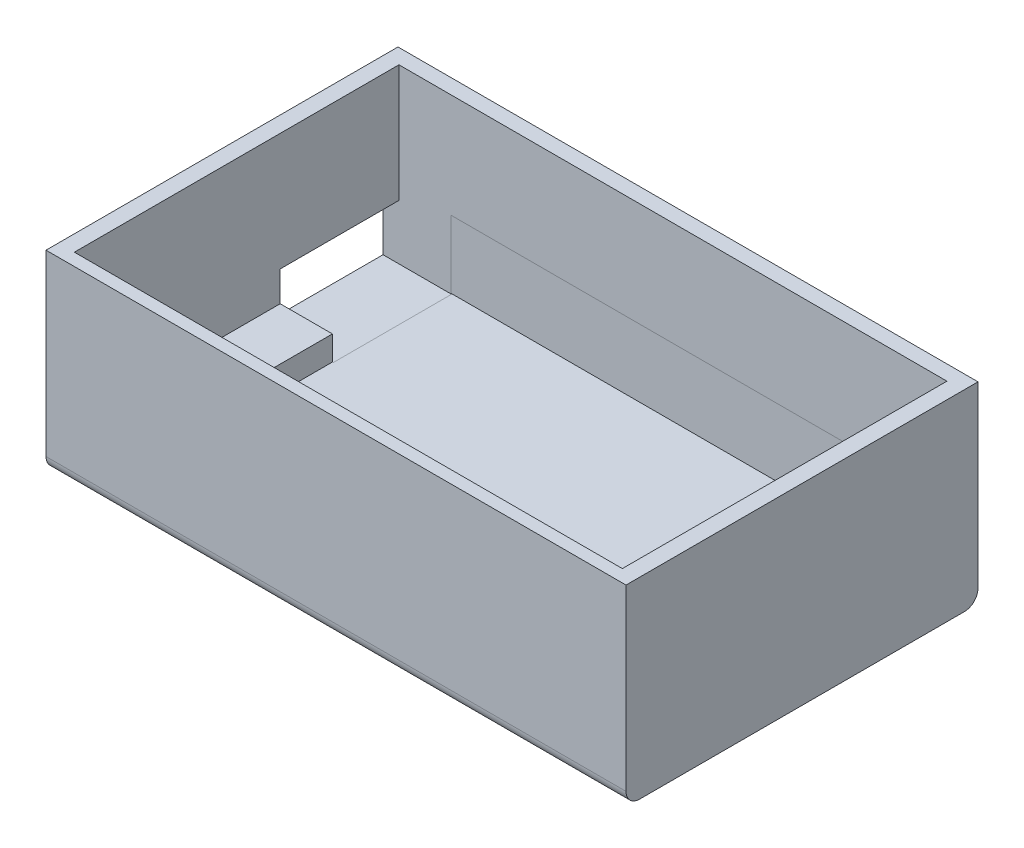
ISO-10303-21;
HEADER;
FILE_DESCRIPTION(('STEP AP214'),'2;1');
FILE_NAME('part.step','',(''),(''),'','','');
FILE_SCHEMA(('AUTOMOTIVE_DESIGN { 1 0 10303 214 1 1 1 1 }'));
ENDSEC;
DATA;
#1=APPLICATION_CONTEXT('core data for automotive mechanical design processes');
#2=APPLICATION_PROTOCOL_DEFINITION('international standard','automotive_design',2000,#1);
#3=PRODUCT_CONTEXT('',#1,'mechanical');
#4=PRODUCT('Part','Part','',(#3));
#5=PRODUCT_RELATED_PRODUCT_CATEGORY('part','',(#4));
#6=PRODUCT_DEFINITION_FORMATION('','',#4);
#7=PRODUCT_DEFINITION_CONTEXT('part definition',#1,'design');
#8=PRODUCT_DEFINITION('design','',#6,#7);
#9=PRODUCT_DEFINITION_SHAPE('','',#8);
#10=(LENGTH_UNIT() NAMED_UNIT(*) SI_UNIT(.MILLI.,.METRE.));
#11=(NAMED_UNIT(*) PLANE_ANGLE_UNIT() SI_UNIT($,.RADIAN.));
#12=(NAMED_UNIT(*) SI_UNIT($,.STERADIAN.) SOLID_ANGLE_UNIT());
#13=UNCERTAINTY_MEASURE_WITH_UNIT(LENGTH_MEASURE(1.E-05),#10,'distance_accuracy_value','');
#14=(GEOMETRIC_REPRESENTATION_CONTEXT(3) GLOBAL_UNCERTAINTY_ASSIGNED_CONTEXT((#13)) GLOBAL_UNIT_ASSIGNED_CONTEXT((#10,
#11,#12)) REPRESENTATION_CONTEXT('',''));
#15=CARTESIAN_POINT('',(0.,0.,0.));
#16=DIRECTION('',(0.,0.,1.));
#17=DIRECTION('',(1.,0.,0.));
#18=AXIS2_PLACEMENT_3D('',#15,#16,#17);
#19=CARTESIAN_POINT('',(-29.7360338558105,16.51,-43.4502757419288));
#20=DIRECTION('',(1.,0.,0.));
#21=DIRECTION('',(0.,0.,-1.));
#22=AXIS2_PLACEMENT_3D('',#19,#20,#21);
#23=PLANE('',#22);
#24=DIRECTION('',(0.,0.,1.));
#25=VECTOR('',#24,1.);
#26=CARTESIAN_POINT('',(-29.7360338558105,16.51,-43.4502757419288));
#27=LINE('',#26,#25);
#28=CARTESIAN_POINT('',(-29.7360338558105,16.51,-43.4502757419288));
#29=VERTEX_POINT('',#28);
#30=CARTESIAN_POINT('',(-29.7360338558105,16.51,-43.4401653698579));
#31=VERTEX_POINT('',#30);
#32=EDGE_CURVE('E327',#29,#31,#27,.T.);
#33=ORIENTED_EDGE('',*,*,#32,.T.);
#34=DIRECTION('',(0.,1.,0.));
#35=VECTOR('',#34,1.);
#36=CARTESIAN_POINT('',(-29.7360338558105,16.51,-43.4401653698579));
#37=LINE('',#36,#35);
#38=CARTESIAN_POINT('',(-29.7360338558105,3.81,-43.4401653698579));
#39=VERTEX_POINT('',#38);
#40=EDGE_CURVE('E315',#39,#31,#37,.T.);
#41=ORIENTED_EDGE('',*,*,#40,.F.);
#42=DIRECTION('',(0.,0.,1.));
#43=VECTOR('',#42,1.);
#44=CARTESIAN_POINT('',(-29.7360338558105,3.81,-43.4502757419288));
#45=LINE('',#44,#43);
#46=CARTESIAN_POINT('',(-29.7360338558105,3.81,-43.4502757419288));
#47=VERTEX_POINT('',#46);
#48=EDGE_CURVE('E324',#47,#39,#45,.T.);
#49=ORIENTED_EDGE('',*,*,#48,.F.);
#50=DIRECTION('',(0.,-1.,0.));
#51=VECTOR('',#50,1.);
#52=CARTESIAN_POINT('',(-29.7360338558105,16.51,-43.4502757419288));
#53=LINE('',#52,#51);
#54=EDGE_CURVE('E347',#29,#47,#53,.T.);
#55=ORIENTED_EDGE('',*,*,#54,.F.);
#56=EDGE_LOOP('',(#33,#41,#49,#55));
#57=FACE_BOUND('',#56,.T.);
#58=ADVANCED_FACE('F65',(#57),#23,.T.);
#59=CARTESIAN_POINT('',(-42.5250491079234,3.81,-46.2471717968124));
#60=DIRECTION('',(1.,0.,0.));
#61=DIRECTION('',(0.,0.,-1.));
#62=AXIS2_PLACEMENT_3D('',#59,#60,#61);
#63=PLANE('',#62);
#64=DIRECTION('',(0.,0.,1.));
#65=VECTOR('',#64,1.);
#66=CARTESIAN_POINT('',(-42.5250491079234,3.71364077573819,-43.4401653698579));
#67=LINE('',#66,#65);
#68=CARTESIAN_POINT('',(-42.5250491079234,3.71364077573819,-43.4401653698579));
#69=VERTEX_POINT('',#68);
#70=CARTESIAN_POINT('',(-42.5250491079234,3.71364077573819,-21.1557204367185));
#71=VERTEX_POINT('',#70);
#72=EDGE_CURVE('E288',#69,#71,#67,.T.);
#73=ORIENTED_EDGE('',*,*,#72,.F.);
#74=DIRECTION('',(0.,-1.,0.));
#75=VECTOR('',#74,1.);
#76=CARTESIAN_POINT('',(-42.5250491079234,14.0343001183845,-43.4401653698579));
#77=LINE('',#76,#75);
#78=CARTESIAN_POINT('',(-42.5250491079234,14.0343001183845,-43.4401653698579));
#79=VERTEX_POINT('',#78);
#80=EDGE_CURVE('E273',#79,#69,#77,.T.);
#81=ORIENTED_EDGE('',*,*,#80,.F.);
#82=DIRECTION('',(0.,0.,1.));
#83=VECTOR('',#82,1.);
#84=CARTESIAN_POINT('',(-42.5250491079234,14.0343001183845,-43.4401653698579));
#85=LINE('',#84,#83);
#86=CARTESIAN_POINT('',(-42.5250491079234,14.0343001183845,-21.1557204367185));
#87=VERTEX_POINT('',#86);
#88=EDGE_CURVE('E278',#79,#87,#85,.T.);
#89=ORIENTED_EDGE('',*,*,#88,.T.);
#90=DIRECTION('',(0.,-1.,0.));
#91=VECTOR('',#90,1.);
#92=CARTESIAN_POINT('',(-42.5250491079234,14.0343001183845,-21.1557204367185));
#93=LINE('',#92,#91);
#94=EDGE_CURVE('E292',#87,#71,#93,.T.);
#95=ORIENTED_EDGE('',*,*,#94,.T.);
#96=EDGE_LOOP('',(#73,#81,#89,#95));
#97=FACE_BOUND('',#96,.T.);
#98=DIRECTION('',(0.,-1.,0.));
#99=VECTOR('',#98,1.);
#100=CARTESIAN_POINT('',(-42.5250491079234,3.81,-46.2471717968124));
#101=LINE('',#100,#99);
#102=CARTESIAN_POINT('',(-42.5250491079234,36.068,-46.2471717968124));
#103=VERTEX_POINT('',#102);
#104=CARTESIAN_POINT('',(-42.5250491079234,2.54,-46.2471717968124));
#105=VERTEX_POINT('',#104);
#106=EDGE_CURVE('E364',#103,#105,#101,.T.);
#107=ORIENTED_EDGE('',*,*,#106,.T.);
#108=CARTESIAN_POINT('',(-42.5250491079234,2.54,-43.7071717968124));
#109=DIRECTION('',(1.,0.,0.));
#110=DIRECTION('',(0.,0.,-1.));
#111=AXIS2_PLACEMENT_3D('',#108,#109,#110);
#112=CIRCLE('',#111,2.54);
#113=CARTESIAN_POINT('',(-42.5250491079234,0.,-43.7071717968124));
#114=VERTEX_POINT('',#113);
#115=EDGE_CURVE('E409',#105,#114,#112,.F.);
#116=ORIENTED_EDGE('',*,*,#115,.T.);
#117=DIRECTION('',(0.,0.,1.));
#118=VECTOR('',#117,1.);
#119=CARTESIAN_POINT('',(-42.5250491079234,0.,-46.2471717968124));
#120=LINE('',#119,#118);
#121=CARTESIAN_POINT('',(-42.5250491079234,0.,17.2528282031876));
#122=VERTEX_POINT('',#121);
#123=EDGE_CURVE('E350',#114,#122,#120,.T.);
#124=ORIENTED_EDGE('',*,*,#123,.T.);
#125=CARTESIAN_POINT('',(-42.5250491079234,2.54,17.2528282031876));
#126=DIRECTION('',(1.,0.,0.));
#127=DIRECTION('',(0.,0.,-1.));
#128=AXIS2_PLACEMENT_3D('',#125,#126,#127);
#129=CIRCLE('',#128,2.54);
#130=CARTESIAN_POINT('',(-42.5250491079234,2.54,19.7928282031876));
#131=VERTEX_POINT('',#130);
#132=EDGE_CURVE('E402',#122,#131,#129,.F.);
#133=ORIENTED_EDGE('',*,*,#132,.T.);
#134=DIRECTION('',(0.,-1.,0.));
#135=VECTOR('',#134,1.);
#136=CARTESIAN_POINT('',(-42.5250491079234,3.81,19.7928282031876));
#137=LINE('',#136,#135);
#138=CARTESIAN_POINT('',(-42.5250491079234,36.068,19.7928282031876));
#139=VERTEX_POINT('',#138);
#140=EDGE_CURVE('E376',#139,#131,#137,.T.);
#141=ORIENTED_EDGE('',*,*,#140,.F.);
#142=DIRECTION('',(0.,0.,1.));
#143=VECTOR('',#142,1.);
#144=CARTESIAN_POINT('',(-42.5250491079234,36.068,19.7928282031876));
#145=LINE('',#144,#143);
#146=EDGE_CURVE('E253',#103,#139,#145,.T.);
#147=ORIENTED_EDGE('',*,*,#146,.F.);
#148=EDGE_LOOP('',(#107,#116,#124,#133,#141,#147));
#149=FACE_BOUND('',#148,.T.);
#150=ADVANCED_FACE('F458',(#97,#149),#63,.F.);
#151=CARTESIAN_POINT('',(-42.5250491079234,3.81,19.7928282031876));
#152=DIRECTION('',(0.,0.,-1.));
#153=DIRECTION('',(-1.,0.,0.));
#154=AXIS2_PLACEMENT_3D('',#151,#152,#153);
#155=PLANE('',#154);
#156=ORIENTED_EDGE('',*,*,#140,.T.);
#157=DIRECTION('',(1.,0.,0.));
#158=VECTOR('',#157,1.);
#159=CARTESIAN_POINT('',(-42.5250491079234,2.54,19.7928282031876));
#160=LINE('',#159,#158);
#161=CARTESIAN_POINT('',(66.2990539113766,2.54,19.7928282031876));
#162=VERTEX_POINT('',#161);
#163=EDGE_CURVE('E391',#131,#162,#160,.T.);
#164=ORIENTED_EDGE('',*,*,#163,.T.);
#165=DIRECTION('',(0.,-1.,0.));
#166=VECTOR('',#165,1.);
#167=CARTESIAN_POINT('',(66.2990539113766,3.81,19.7928282031876));
#168=LINE('',#167,#166);
#169=CARTESIAN_POINT('',(66.2990539113766,36.068,19.7928282031876));
#170=VERTEX_POINT('',#169);
#171=EDGE_CURVE('E372',#170,#162,#168,.T.);
#172=ORIENTED_EDGE('',*,*,#171,.F.);
#173=DIRECTION('',(1.,0.,0.));
#174=VECTOR('',#173,1.);
#175=CARTESIAN_POINT('',(66.2990539113766,36.068,19.7928282031876));
#176=LINE('',#175,#174);
#177=EDGE_CURVE('E257',#139,#170,#176,.T.);
#178=ORIENTED_EDGE('',*,*,#177,.F.);
#179=EDGE_LOOP('',(#156,#164,#172,#178));
#180=FACE_BOUND('',#179,.T.);
#181=ADVANCED_FACE('F461',(#180),#155,.F.);
#182=CARTESIAN_POINT('',(66.2990539113766,3.81,-46.2471717968124));
#183=DIRECTION('',(-1.,0.,0.));
#184=DIRECTION('',(0.,0.,1.));
#185=AXIS2_PLACEMENT_3D('',#182,#183,#184);
#186=PLANE('',#185);
#187=DIRECTION('',(0.,0.,-1.));
#188=VECTOR('',#187,1.);
#189=CARTESIAN_POINT('',(66.2990539113766,0.,-46.2471717968124));
#190=LINE('',#189,#188);
#191=CARTESIAN_POINT('',(66.2990539113766,0.,17.2528282031876));
#192=VERTEX_POINT('',#191);
#193=CARTESIAN_POINT('',(66.2990539113766,0.,-43.7071717968124));
#194=VERTEX_POINT('',#193);
#195=EDGE_CURVE('E361',#192,#194,#190,.T.);
#196=ORIENTED_EDGE('',*,*,#195,.T.);
#197=CARTESIAN_POINT('',(66.2990539113766,2.54,-43.7071717968124));
#198=DIRECTION('',(-1.,0.,0.));
#199=DIRECTION('',(0.,0.,1.));
#200=AXIS2_PLACEMENT_3D('',#197,#198,#199);
#201=CIRCLE('',#200,2.54);
#202=CARTESIAN_POINT('',(66.2990539113766,2.54,-46.2471717968124));
#203=VERTEX_POINT('',#202);
#204=EDGE_CURVE('E414',#194,#203,#201,.F.);
#205=ORIENTED_EDGE('',*,*,#204,.T.);
#206=DIRECTION('',(0.,-1.,0.));
#207=VECTOR('',#206,1.);
#208=CARTESIAN_POINT('',(66.2990539113766,3.81,-46.2471717968124));
#209=LINE('',#208,#207);
#210=CARTESIAN_POINT('',(66.2990539113766,36.068,-46.2471717968124));
#211=VERTEX_POINT('',#210);
#212=EDGE_CURVE('E368',#211,#203,#209,.T.);
#213=ORIENTED_EDGE('',*,*,#212,.F.);
#214=DIRECTION('',(0.,0.,-1.));
#215=VECTOR('',#214,1.);
#216=CARTESIAN_POINT('',(66.2990539113766,36.068,19.7928282031876));
#217=LINE('',#216,#215);
#218=EDGE_CURVE('E245',#170,#211,#217,.T.);
#219=ORIENTED_EDGE('',*,*,#218,.F.);
#220=ORIENTED_EDGE('',*,*,#171,.T.);
#221=CARTESIAN_POINT('',(66.2990539113766,2.54,17.2528282031876));
#222=DIRECTION('',(-1.,0.,0.));
#223=DIRECTION('',(0.,0.,1.));
#224=AXIS2_PLACEMENT_3D('',#221,#222,#223);
#225=CIRCLE('',#224,2.54);
#226=EDGE_CURVE('E395',#162,#192,#225,.F.);
#227=ORIENTED_EDGE('',*,*,#226,.T.);
#228=EDGE_LOOP('',(#196,#205,#213,#219,#220,#227));
#229=FACE_BOUND('',#228,.T.);
#230=ADVANCED_FACE('F472',(#229),#186,.F.);
#231=CARTESIAN_POINT('',(-42.5250491079234,3.81,-46.2471717968124));
#232=DIRECTION('',(0.,0.,1.));
#233=DIRECTION('',(1.,0.,0.));
#234=AXIS2_PLACEMENT_3D('',#231,#232,#233);
#235=PLANE('',#234);
#236=ORIENTED_EDGE('',*,*,#212,.T.);
#237=DIRECTION('',(-1.,0.,0.));
#238=VECTOR('',#237,1.);
#239=CARTESIAN_POINT('',(-42.5250491079234,2.54,-46.2471717968124));
#240=LINE('',#239,#238);
#241=EDGE_CURVE('E405',#203,#105,#240,.T.);
#242=ORIENTED_EDGE('',*,*,#241,.T.);
#243=ORIENTED_EDGE('',*,*,#106,.F.);
#244=DIRECTION('',(-1.,0.,0.));
#245=VECTOR('',#244,1.);
#246=CARTESIAN_POINT('',(66.2990539113766,36.068,-46.2471717968124));
#247=LINE('',#246,#245);
#248=EDGE_CURVE('E249',#211,#103,#247,.T.);
#249=ORIENTED_EDGE('',*,*,#248,.F.);
#250=EDGE_LOOP('',(#236,#242,#243,#249));
#251=FACE_BOUND('',#250,.T.);
#252=ADVANCED_FACE('F466',(#251),#235,.F.);
#253=CARTESIAN_POINT('',(0.,0.,0.));
#254=DIRECTION('',(0.,1.,0.));
#255=DIRECTION('',(0.,0.,1.));
#256=AXIS2_PLACEMENT_3D('',#253,#254,#255);
#257=PLANE('',#256);
#258=ORIENTED_EDGE('',*,*,#123,.F.);
#259=DIRECTION('',(-1.,0.,0.));
#260=VECTOR('',#259,1.);
#261=CARTESIAN_POINT('',(0.,0.,-43.7071717968124));
#262=LINE('',#261,#260);
#263=EDGE_CURVE('E89',#114,#194,#262,.F.);
#264=ORIENTED_EDGE('',*,*,#263,.T.);
#265=ORIENTED_EDGE('',*,*,#195,.F.);
#266=DIRECTION('',(1.,0.,0.));
#267=VECTOR('',#266,1.);
#268=CARTESIAN_POINT('',(0.,0.,17.2528282031876));
#269=LINE('',#268,#267);
#270=EDGE_CURVE('E398',#192,#122,#269,.F.);
#271=ORIENTED_EDGE('',*,*,#270,.T.);
#272=EDGE_LOOP('',(#258,#264,#265,#271));
#273=FACE_BOUND('',#272,.T.);
#274=ADVANCED_FACE('F496',(#273),#257,.F.);
#275=CARTESIAN_POINT('',(-29.7360338558105,16.51,-43.4502757419288));
#276=DIRECTION('',(0.,0.,-1.));
#277=DIRECTION('',(-1.,0.,0.));
#278=AXIS2_PLACEMENT_3D('',#275,#276,#277);
#279=PLANE('',#278);
#280=DIRECTION('',(1.,0.,0.));
#281=VECTOR('',#280,1.);
#282=CARTESIAN_POINT('',(-29.7360338558105,3.81,-43.4502757419288));
#283=LINE('',#282,#281);
#284=CARTESIAN_POINT('',(63.2787661441895,3.81,-43.4502757419288));
#285=VERTEX_POINT('',#284);
#286=EDGE_CURVE('E319',#47,#285,#283,.T.);
#287=ORIENTED_EDGE('',*,*,#286,.T.);
#288=DIRECTION('',(0.,-1.,0.));
#289=VECTOR('',#288,1.);
#290=CARTESIAN_POINT('',(63.2787661441895,16.51,-43.4502757419288));
#291=LINE('',#290,#289);
#292=CARTESIAN_POINT('',(63.2787661441895,16.51,-43.4502757419288));
#293=VERTEX_POINT('',#292);
#294=EDGE_CURVE('E331',#293,#285,#291,.T.);
#295=ORIENTED_EDGE('',*,*,#294,.F.);
#296=DIRECTION('',(1.,0.,0.));
#297=VECTOR('',#296,1.);
#298=CARTESIAN_POINT('',(-29.7360338558105,16.51,-43.4502757419288));
#299=LINE('',#298,#297);
#300=EDGE_CURVE('E320',#29,#293,#299,.T.);
#301=ORIENTED_EDGE('',*,*,#300,.F.);
#302=ORIENTED_EDGE('',*,*,#54,.T.);
#303=EDGE_LOOP('',(#287,#295,#301,#302));
#304=FACE_BOUND('',#303,.T.);
#305=ADVANCED_FACE('F491',(#304),#279,.F.);
#306=DIRECTION('',(0.,0.,-1.));
#307=VECTOR('',#306,1.);
#308=CARTESIAN_POINT('',(-29.7360338558105,8.382,-43.4502757419288));
#309=LINE('',#308,#307);
#310=CARTESIAN_POINT('',(-29.7360338558105,8.382,17.4589242580711));
#311=VERTEX_POINT('',#310);
#312=CARTESIAN_POINT('',(-29.7360338558105,8.382,-21.1557204367185));
#313=VERTEX_POINT('',#312);
#314=EDGE_CURVE('E81',#311,#313,#309,.T.);
#315=ORIENTED_EDGE('',*,*,#314,.F.);
#316=DIRECTION('',(0.,-1.,0.));
#317=VECTOR('',#316,1.);
#318=CARTESIAN_POINT('',(-29.7360338558105,16.51,17.4589242580711));
#319=LINE('',#318,#317);
#320=CARTESIAN_POINT('',(-29.7360338558105,3.81,17.4589242580711));
#321=VERTEX_POINT('',#320);
#322=EDGE_CURVE('E351',#311,#321,#319,.T.);
#323=ORIENTED_EDGE('',*,*,#322,.T.);
#324=CARTESIAN_POINT('',(-29.7360338558105,3.81,-21.1557204367185));
#325=VERTEX_POINT('',#324);
#326=EDGE_CURVE('E343',#325,#321,#45,.T.);
#327=ORIENTED_EDGE('',*,*,#326,.F.);
#328=DIRECTION('',(0.,1.,0.));
#329=VECTOR('',#328,1.);
#330=CARTESIAN_POINT('',(-29.7360338558105,16.51,-21.1557204367185));
#331=LINE('',#330,#329);
#332=EDGE_CURVE('E302',#325,#313,#331,.T.);
#333=ORIENTED_EDGE('',*,*,#332,.T.);
#334=EDGE_LOOP('',(#315,#323,#327,#333));
#335=FACE_BOUND('',#334,.T.);
#336=ADVANCED_FACE('F446',(#335),#23,.T.);
#337=CARTESIAN_POINT('',(-29.7360338558105,16.51,17.4589242580711));
#338=DIRECTION('',(0.,0.,-1.));
#339=DIRECTION('',(-1.,0.,0.));
#340=AXIS2_PLACEMENT_3D('',#337,#338,#339);
#341=PLANE('',#340);
#342=DIRECTION('',(0.,1.,0.));
#343=VECTOR('',#342,1.);
#344=CARTESIAN_POINT('',(-39.5353776185125,8.382,17.4589242580711));
#345=LINE('',#344,#343);
#346=CARTESIAN_POINT('',(-39.5353776185125,8.382,17.4589242580711));
#347=VERTEX_POINT('',#346);
#348=CARTESIAN_POINT('',(-39.5353776185125,36.068,17.4589242580711));
#349=VERTEX_POINT('',#348);
#350=EDGE_CURVE('E205',#347,#349,#345,.T.);
#351=ORIENTED_EDGE('',*,*,#350,.T.);
#352=DIRECTION('',(1.,0.,0.));
#353=VECTOR('',#352,1.);
#354=CARTESIAN_POINT('',(-39.5353776185125,36.068,17.4589242580711));
#355=LINE('',#354,#353);
#356=CARTESIAN_POINT('',(63.2787661441895,36.068,17.4589242580711));
#357=VERTEX_POINT('',#356);
#358=EDGE_CURVE('E209',#349,#357,#355,.T.);
#359=ORIENTED_EDGE('',*,*,#358,.T.);
#360=DIRECTION('',(0.,-1.,0.));
#361=VECTOR('',#360,1.);
#362=CARTESIAN_POINT('',(63.2787661441895,16.51,17.4589242580711));
#363=LINE('',#362,#361);
#364=CARTESIAN_POINT('',(63.2787661441895,3.81,17.4589242580711));
#365=VERTEX_POINT('',#364);
#366=EDGE_CURVE('E354',#357,#365,#363,.T.);
#367=ORIENTED_EDGE('',*,*,#366,.T.);
#368=DIRECTION('',(1.,0.,0.));
#369=VECTOR('',#368,1.);
#370=CARTESIAN_POINT('',(-29.7360338558105,3.81,17.4589242580711));
#371=LINE('',#370,#369);
#372=EDGE_CURVE('E339',#321,#365,#371,.T.);
#373=ORIENTED_EDGE('',*,*,#372,.F.);
#374=ORIENTED_EDGE('',*,*,#322,.F.);
#375=DIRECTION('',(1.,0.,0.));
#376=VECTOR('',#375,1.);
#377=CARTESIAN_POINT('',(-29.5710491079234,8.382,17.4589242580711));
#378=LINE('',#377,#376);
#379=EDGE_CURVE('E212',#347,#311,#378,.T.);
#380=ORIENTED_EDGE('',*,*,#379,.F.);
#381=EDGE_LOOP('',(#351,#359,#367,#373,#374,#380));
#382=FACE_BOUND('',#381,.T.);
#383=ADVANCED_FACE('F207',(#382),#341,.T.);
#384=CARTESIAN_POINT('',(63.2787661441895,16.51,-43.4502757419288));
#385=DIRECTION('',(1.,0.,0.));
#386=DIRECTION('',(0.,0.,-1.));
#387=AXIS2_PLACEMENT_3D('',#384,#385,#386);
#388=PLANE('',#387);
#389=DIRECTION('',(0.,0.,1.));
#390=VECTOR('',#389,1.);
#391=CARTESIAN_POINT('',(63.2787661441895,3.81,-43.4502757419288));
#392=LINE('',#391,#390);
#393=EDGE_CURVE('E335',#285,#365,#392,.T.);
#394=ORIENTED_EDGE('',*,*,#393,.T.);
#395=ORIENTED_EDGE('',*,*,#366,.F.);
#396=DIRECTION('',(0.,0.,-1.));
#397=VECTOR('',#396,1.);
#398=CARTESIAN_POINT('',(63.2787661441895,36.068,-43.4401653698579));
#399=LINE('',#398,#397);
#400=CARTESIAN_POINT('',(63.2787661441895,36.068,-43.4401653698579));
#401=VERTEX_POINT('',#400);
#402=EDGE_CURVE('E230',#357,#401,#399,.T.);
#403=ORIENTED_EDGE('',*,*,#402,.T.);
#404=DIRECTION('',(0.,-1.,0.));
#405=VECTOR('',#404,1.);
#406=CARTESIAN_POINT('',(63.2787661441895,36.068,-43.4401653698579));
#407=LINE('',#406,#405);
#408=CARTESIAN_POINT('',(63.2787661441895,16.51,-43.4401653698579));
#409=VERTEX_POINT('',#408);
#410=EDGE_CURVE('E239',#401,#409,#407,.T.);
#411=ORIENTED_EDGE('',*,*,#410,.T.);
#412=DIRECTION('',(0.,0.,1.));
#413=VECTOR('',#412,1.);
#414=CARTESIAN_POINT('',(63.2787661441895,16.51,-43.4502757419288));
#415=LINE('',#414,#413);
#416=EDGE_CURVE('E323',#293,#409,#415,.T.);
#417=ORIENTED_EDGE('',*,*,#416,.F.);
#418=ORIENTED_EDGE('',*,*,#294,.T.);
#419=EDGE_LOOP('',(#394,#395,#403,#411,#417,#418));
#420=FACE_BOUND('',#419,.T.);
#421=ADVANCED_FACE('F434',(#420),#388,.F.);
#422=CARTESIAN_POINT('',(0.,3.81,0.));
#423=DIRECTION('',(0.,1.,0.));
#424=DIRECTION('',(0.,0.,1.));
#425=AXIS2_PLACEMENT_3D('',#422,#423,#424);
#426=PLANE('',#425);
#427=DIRECTION('',(-1.,0.,0.));
#428=VECTOR('',#427,1.);
#429=CARTESIAN_POINT('',(0.,3.81,-43.4401653698579));
#430=LINE('',#429,#428);
#431=CARTESIAN_POINT('',(-29.5710491079234,3.81,-43.4401653698579));
#432=VERTEX_POINT('',#431);
#433=EDGE_CURVE('E388',#432,#39,#430,.T.);
#434=ORIENTED_EDGE('',*,*,#433,.F.);
#435=DIRECTION('',(0.,0.,1.));
#436=VECTOR('',#435,1.);
#437=CARTESIAN_POINT('',(-29.5710491079234,3.81,0.));
#438=LINE('',#437,#436);
#439=CARTESIAN_POINT('',(-29.5710491079234,3.81,-21.1557204367185));
#440=VERTEX_POINT('',#439);
#441=EDGE_CURVE('E380',#432,#440,#438,.T.);
#442=ORIENTED_EDGE('',*,*,#441,.T.);
#443=DIRECTION('',(-1.,0.,0.));
#444=VECTOR('',#443,1.);
#445=CARTESIAN_POINT('',(0.,3.81,-21.1557204367185));
#446=LINE('',#445,#444);
#447=EDGE_CURVE('E384',#440,#325,#446,.T.);
#448=ORIENTED_EDGE('',*,*,#447,.T.);
#449=ORIENTED_EDGE('',*,*,#326,.T.);
#450=ORIENTED_EDGE('',*,*,#372,.T.);
#451=ORIENTED_EDGE('',*,*,#393,.F.);
#452=ORIENTED_EDGE('',*,*,#286,.F.);
#453=ORIENTED_EDGE('',*,*,#48,.T.);
#454=EDGE_LOOP('',(#434,#442,#448,#449,#450,#451,#452,#453));
#455=FACE_BOUND('',#454,.T.);
#456=ADVANCED_FACE('F440',(#455),#426,.T.);
#457=CARTESIAN_POINT('',(-29.5710491079234,14.0343001183845,-43.4401653698579));
#458=DIRECTION('',(0.,0.,-1.));
#459=DIRECTION('',(-1.,0.,0.));
#460=AXIS2_PLACEMENT_3D('',#457,#458,#459);
#461=PLANE('',#460);
#462=DIRECTION('',(0.,1.,0.));
#463=VECTOR('',#462,1.);
#464=CARTESIAN_POINT('',(-39.5353776185125,8.382,-43.4401653698579));
#465=LINE('',#464,#463);
#466=CARTESIAN_POINT('',(-39.5353776185125,14.0343001183845,-43.4401653698579));
#467=VERTEX_POINT('',#466);
#468=CARTESIAN_POINT('',(-39.5353776185125,36.068,-43.4401653698579));
#469=VERTEX_POINT('',#468);
#470=EDGE_CURVE('E216',#467,#469,#465,.T.);
#471=ORIENTED_EDGE('',*,*,#470,.F.);
#472=DIRECTION('',(-1.,0.,0.));
#473=VECTOR('',#472,1.);
#474=CARTESIAN_POINT('',(-29.5710491079234,14.0343001183845,-43.4401653698579));
#475=LINE('',#474,#473);
#476=EDGE_CURVE('E299',#467,#79,#475,.T.);
#477=ORIENTED_EDGE('',*,*,#476,.T.);
#478=ORIENTED_EDGE('',*,*,#80,.T.);
#479=DIRECTION('',(-1.,0.,0.));
#480=VECTOR('',#479,1.);
#481=CARTESIAN_POINT('',(-29.5710491079234,3.71364077573819,-43.4401653698579));
#482=LINE('',#481,#480);
#483=CARTESIAN_POINT('',(-29.5710491079234,3.71364077573819,-43.4401653698579));
#484=VERTEX_POINT('',#483);
#485=EDGE_CURVE('E285',#484,#69,#482,.T.);
#486=ORIENTED_EDGE('',*,*,#485,.F.);
#487=DIRECTION('',(0.,-1.,0.));
#488=VECTOR('',#487,1.);
#489=CARTESIAN_POINT('',(-29.5710491079234,14.0343001183845,-43.4401653698579));
#490=LINE('',#489,#488);
#491=EDGE_CURVE('E274',#432,#484,#490,.T.);
#492=ORIENTED_EDGE('',*,*,#491,.F.);
#493=ORIENTED_EDGE('',*,*,#433,.T.);
#494=ORIENTED_EDGE('',*,*,#40,.T.);
#495=DIRECTION('',(-1.,0.,0.));
#496=VECTOR('',#495,1.);
#497=CARTESIAN_POINT('',(-39.5353776185125,16.51,-43.4401653698579));
#498=LINE('',#497,#496);
#499=EDGE_CURVE('E226',#409,#31,#498,.T.);
#500=ORIENTED_EDGE('',*,*,#499,.F.);
#501=ORIENTED_EDGE('',*,*,#410,.F.);
#502=DIRECTION('',(-1.,0.,0.));
#503=VECTOR('',#502,1.);
#504=CARTESIAN_POINT('',(-39.5353776185125,36.068,-43.4401653698579));
#505=LINE('',#504,#503);
#506=EDGE_CURVE('E234',#401,#469,#505,.T.);
#507=ORIENTED_EDGE('',*,*,#506,.T.);
#508=EDGE_LOOP('',(#471,#477,#478,#486,#492,#493,#494,#500,#501,#507));
#509=FACE_BOUND('',#508,.T.);
#510=ADVANCED_FACE('F430',(#509),#461,.F.);
#511=CARTESIAN_POINT('',(-29.5710491079234,14.0343001183845,-43.4401653698579));
#512=DIRECTION('',(0.,-1.,0.));
#513=DIRECTION('',(0.,0.,-1.));
#514=AXIS2_PLACEMENT_3D('',#511,#512,#513);
#515=PLANE('',#514);
#516=DIRECTION('',(0.,0.,-1.));
#517=VECTOR('',#516,1.);
#518=CARTESIAN_POINT('',(-39.5353776185125,14.0343001183845,-43.4401653698579));
#519=LINE('',#518,#517);
#520=CARTESIAN_POINT('',(-39.5353776185125,14.0343001183845,-21.1557204367185));
#521=VERTEX_POINT('',#520);
#522=EDGE_CURVE('E270',#521,#467,#519,.T.);
#523=ORIENTED_EDGE('',*,*,#522,.F.);
#524=DIRECTION('',(-1.,0.,0.));
#525=VECTOR('',#524,1.);
#526=CARTESIAN_POINT('',(-29.5710491079234,14.0343001183845,-21.1557204367185));
#527=LINE('',#526,#525);
#528=EDGE_CURVE('E303',#521,#87,#527,.T.);
#529=ORIENTED_EDGE('',*,*,#528,.T.);
#530=ORIENTED_EDGE('',*,*,#88,.F.);
#531=ORIENTED_EDGE('',*,*,#476,.F.);
#532=EDGE_LOOP('',(#523,#529,#530,#531));
#533=FACE_BOUND('',#532,.T.);
#534=ADVANCED_FACE('F426',(#533),#515,.T.);
#535=CARTESIAN_POINT('',(-29.5710491079234,14.0343001183845,-21.1557204367185));
#536=DIRECTION('',(0.,0.,-1.));
#537=DIRECTION('',(-1.,0.,0.));
#538=AXIS2_PLACEMENT_3D('',#535,#536,#537);
#539=PLANE('',#538);
#540=DIRECTION('',(0.,1.,0.));
#541=VECTOR('',#540,1.);
#542=CARTESIAN_POINT('',(-39.5353776185125,14.0343001183845,-21.1557204367185));
#543=LINE('',#542,#541);
#544=CARTESIAN_POINT('',(-39.5353776185125,8.382,-21.1557204367185));
#545=VERTEX_POINT('',#544);
#546=EDGE_CURVE('E12',#545,#521,#543,.T.);
#547=ORIENTED_EDGE('',*,*,#546,.F.);
#548=DIRECTION('',(-1.,0.,0.));
#549=VECTOR('',#548,1.);
#550=CARTESIAN_POINT('',(-29.5710491079234,8.382,-21.1557204367185));
#551=LINE('',#550,#549);
#552=EDGE_CURVE('E74',#313,#545,#551,.T.);
#553=ORIENTED_EDGE('',*,*,#552,.F.);
#554=ORIENTED_EDGE('',*,*,#332,.F.);
#555=ORIENTED_EDGE('',*,*,#447,.F.);
#556=DIRECTION('',(0.,-1.,0.));
#557=VECTOR('',#556,1.);
#558=CARTESIAN_POINT('',(-29.5710491079234,14.0343001183845,-21.1557204367185));
#559=LINE('',#558,#557);
#560=CARTESIAN_POINT('',(-29.5710491079234,3.71364077573819,-21.1557204367185));
#561=VERTEX_POINT('',#560);
#562=EDGE_CURVE('E282',#440,#561,#559,.T.);
#563=ORIENTED_EDGE('',*,*,#562,.T.);
#564=DIRECTION('',(-1.,0.,0.));
#565=VECTOR('',#564,1.);
#566=CARTESIAN_POINT('',(-29.5710491079234,3.71364077573819,-21.1557204367185));
#567=LINE('',#566,#565);
#568=EDGE_CURVE('E306',#561,#71,#567,.T.);
#569=ORIENTED_EDGE('',*,*,#568,.T.);
#570=ORIENTED_EDGE('',*,*,#94,.F.);
#571=ORIENTED_EDGE('',*,*,#528,.F.);
#572=EDGE_LOOP('',(#547,#553,#554,#555,#563,#569,#570,#571));
#573=FACE_BOUND('',#572,.T.);
#574=ADVANCED_FACE('F422',(#573),#539,.T.);
#575=CARTESIAN_POINT('',(-29.5710491079234,3.71364077573819,-43.4401653698579));
#576=DIRECTION('',(0.,-1.,0.));
#577=DIRECTION('',(0.,0.,-1.));
#578=AXIS2_PLACEMENT_3D('',#575,#576,#577);
#579=PLANE('',#578);
#580=ORIENTED_EDGE('',*,*,#72,.T.);
#581=ORIENTED_EDGE('',*,*,#568,.F.);
#582=DIRECTION('',(0.,0.,1.));
#583=VECTOR('',#582,1.);
#584=CARTESIAN_POINT('',(-29.5710491079234,3.71364077573819,-43.4401653698579));
#585=LINE('',#584,#583);
#586=EDGE_CURVE('E277',#484,#561,#585,.T.);
#587=ORIENTED_EDGE('',*,*,#586,.F.);
#588=ORIENTED_EDGE('',*,*,#485,.T.);
#589=EDGE_LOOP('',(#580,#581,#587,#588));
#590=FACE_BOUND('',#589,.T.);
#591=ADVANCED_FACE('F456',(#590),#579,.F.);
#592=CARTESIAN_POINT('',(-29.5710491079234,0.,0.));
#593=DIRECTION('',(-1.,0.,0.));
#594=DIRECTION('',(0.,0.,1.));
#595=AXIS2_PLACEMENT_3D('',#592,#593,#594);
#596=PLANE('',#595);
#597=ORIENTED_EDGE('',*,*,#491,.T.);
#598=ORIENTED_EDGE('',*,*,#586,.T.);
#599=ORIENTED_EDGE('',*,*,#562,.F.);
#600=ORIENTED_EDGE('',*,*,#441,.F.);
#601=EDGE_LOOP('',(#597,#598,#599,#600));
#602=FACE_BOUND('',#601,.T.);
#603=ADVANCED_FACE('F450',(#602),#596,.T.);
#604=CARTESIAN_POINT('',(-42.5250491079234,2.54,17.2528282031876));
#605=DIRECTION('',(1.,0.,0.));
#606=DIRECTION('',(0.,0.,-1.));
#607=AXIS2_PLACEMENT_3D('',#604,#605,#606);
#608=CYLINDRICAL_SURFACE('',#607,2.54);
#609=ORIENTED_EDGE('',*,*,#132,.F.);
#610=ORIENTED_EDGE('',*,*,#270,.F.);
#611=ORIENTED_EDGE('',*,*,#226,.F.);
#612=ORIENTED_EDGE('',*,*,#163,.F.);
#613=EDGE_LOOP('',(#609,#610,#611,#612));
#614=FACE_BOUND('',#613,.T.);
#615=ADVANCED_FACE('F476',(#614),#608,.T.);
#616=CARTESIAN_POINT('',(-42.5250491079234,2.54,-43.7071717968124));
#617=DIRECTION('',(-1.,0.,0.));
#618=DIRECTION('',(0.,0.,1.));
#619=AXIS2_PLACEMENT_3D('',#616,#617,#618);
#620=CYLINDRICAL_SURFACE('',#619,2.54);
#621=ORIENTED_EDGE('',*,*,#204,.F.);
#622=ORIENTED_EDGE('',*,*,#263,.F.);
#623=ORIENTED_EDGE('',*,*,#115,.F.);
#624=ORIENTED_EDGE('',*,*,#241,.F.);
#625=EDGE_LOOP('',(#621,#622,#623,#624));
#626=FACE_BOUND('',#625,.T.);
#627=ADVANCED_FACE('F67',(#626),#620,.T.);
#628=CARTESIAN_POINT('',(-39.5353776185125,8.382,-43.4401653698579));
#629=DIRECTION('',(-1.,0.,0.));
#630=DIRECTION('',(0.,0.,1.));
#631=AXIS2_PLACEMENT_3D('',#628,#629,#630);
#632=PLANE('',#631);
#633=ORIENTED_EDGE('',*,*,#522,.T.);
#634=ORIENTED_EDGE('',*,*,#470,.T.);
#635=DIRECTION('',(0.,0.,1.));
#636=VECTOR('',#635,1.);
#637=CARTESIAN_POINT('',(-39.5353776185125,36.068,-43.4401653698579));
#638=LINE('',#637,#636);
#639=EDGE_CURVE('E219',#469,#349,#638,.T.);
#640=ORIENTED_EDGE('',*,*,#639,.T.);
#641=ORIENTED_EDGE('',*,*,#350,.F.);
#642=DIRECTION('',(0.,0.,1.));
#643=VECTOR('',#642,1.);
#644=CARTESIAN_POINT('',(-39.5353776185125,8.382,-43.4401653698579));
#645=LINE('',#644,#643);
#646=EDGE_CURVE('E261',#545,#347,#645,.T.);
#647=ORIENTED_EDGE('',*,*,#646,.F.);
#648=ORIENTED_EDGE('',*,*,#546,.T.);
#649=EDGE_LOOP('',(#633,#634,#640,#641,#647,#648));
#650=FACE_BOUND('',#649,.T.);
#651=ADVANCED_FACE('F220',(#650),#632,.F.);
#652=CARTESIAN_POINT('',(0.,8.382,0.));
#653=DIRECTION('',(0.,-1.,0.));
#654=DIRECTION('',(0.,0.,-1.));
#655=AXIS2_PLACEMENT_3D('',#652,#653,#654);
#656=PLANE('',#655);
#657=ORIENTED_EDGE('',*,*,#314,.T.);
#658=ORIENTED_EDGE('',*,*,#552,.T.);
#659=ORIENTED_EDGE('',*,*,#646,.T.);
#660=ORIENTED_EDGE('',*,*,#379,.T.);
#661=EDGE_LOOP('',(#657,#658,#659,#660));
#662=FACE_BOUND('',#661,.T.);
#663=ADVANCED_FACE('F417',(#662),#656,.F.);
#664=CARTESIAN_POINT('',(0.,36.068,0.));
#665=DIRECTION('',(0.,1.,0.));
#666=DIRECTION('',(0.,0.,1.));
#667=AXIS2_PLACEMENT_3D('',#664,#665,#666);
#668=PLANE('',#667);
#669=ORIENTED_EDGE('',*,*,#218,.T.);
#670=ORIENTED_EDGE('',*,*,#248,.T.);
#671=ORIENTED_EDGE('',*,*,#146,.T.);
#672=ORIENTED_EDGE('',*,*,#177,.T.);
#673=EDGE_LOOP('',(#669,#670,#671,#672));
#674=FACE_BOUND('',#673,.T.);
#675=ORIENTED_EDGE('',*,*,#358,.F.);
#676=ORIENTED_EDGE('',*,*,#639,.F.);
#677=ORIENTED_EDGE('',*,*,#506,.F.);
#678=ORIENTED_EDGE('',*,*,#402,.F.);
#679=EDGE_LOOP('',(#675,#676,#677,#678));
#680=FACE_BOUND('',#679,.T.);
#681=ADVANCED_FACE('F228',(#674,#680),#668,.T.);
#682=CARTESIAN_POINT('',(0.,16.51,0.));
#683=DIRECTION('',(0.,1.,0.));
#684=DIRECTION('',(0.,0.,1.));
#685=AXIS2_PLACEMENT_3D('',#682,#683,#684);
#686=PLANE('',#685);
#687=ORIENTED_EDGE('',*,*,#32,.F.);
#688=ORIENTED_EDGE('',*,*,#300,.T.);
#689=ORIENTED_EDGE('',*,*,#416,.T.);
#690=ORIENTED_EDGE('',*,*,#499,.T.);
#691=EDGE_LOOP('',(#687,#688,#689,#690));
#692=FACE_BOUND('',#691,.T.);
#693=ADVANCED_FACE('F648',(#692),#686,.F.);
#694=CLOSED_SHELL('',(#58,#150,#181,#230,#252,#274,#305,#336,#383,#421,#456,#510,#534,#574,#591,
#603,#615,#627,#651,#663,#681,#693));
#695=MANIFOLD_SOLID_BREP('B2',#694);
#696=ADVANCED_BREP_SHAPE_REPRESENTATION('',(#18,#695),#14);
#697=SHAPE_DEFINITION_REPRESENTATION(#9,#696);
ENDSEC;
END-ISO-10303-21;
